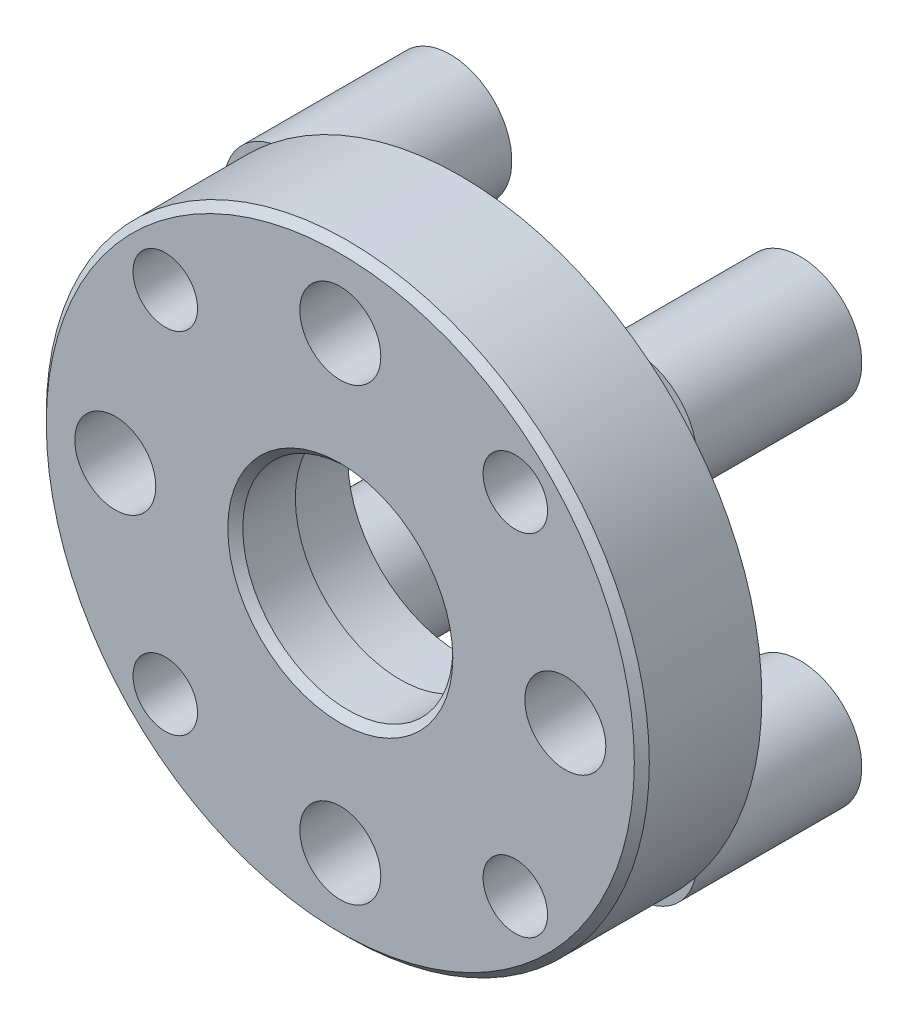
ISO-10303-21;
HEADER;
FILE_DESCRIPTION(('STEP AP214'),'2;1');
FILE_NAME('part.step','',(''),(''),'','','');
FILE_SCHEMA(('AUTOMOTIVE_DESIGN { 1 0 10303 214 1 1 1 1 }'));
ENDSEC;
DATA;
#1=APPLICATION_CONTEXT('core data for automotive mechanical design processes');
#2=APPLICATION_PROTOCOL_DEFINITION('international standard','automotive_design',2000,#1);
#3=PRODUCT_CONTEXT('',#1,'mechanical');
#4=PRODUCT('Part','Part','',(#3));
#5=PRODUCT_RELATED_PRODUCT_CATEGORY('part','',(#4));
#6=PRODUCT_DEFINITION_FORMATION('','',#4);
#7=PRODUCT_DEFINITION_CONTEXT('part definition',#1,'design');
#8=PRODUCT_DEFINITION('design','',#6,#7);
#9=PRODUCT_DEFINITION_SHAPE('','',#8);
#10=(LENGTH_UNIT() NAMED_UNIT(*) SI_UNIT(.MILLI.,.METRE.));
#11=(NAMED_UNIT(*) PLANE_ANGLE_UNIT() SI_UNIT($,.RADIAN.));
#12=(NAMED_UNIT(*) SI_UNIT($,.STERADIAN.) SOLID_ANGLE_UNIT());
#13=UNCERTAINTY_MEASURE_WITH_UNIT(LENGTH_MEASURE(1.E-05),#10,'distance_accuracy_value','');
#14=(GEOMETRIC_REPRESENTATION_CONTEXT(3) GLOBAL_UNCERTAINTY_ASSIGNED_CONTEXT((#13)) GLOBAL_UNIT_ASSIGNED_CONTEXT((#10,
#11,#12)) REPRESENTATION_CONTEXT('',''));
#15=CARTESIAN_POINT('',(0.,0.,0.));
#16=DIRECTION('',(0.,0.,1.));
#17=DIRECTION('',(1.,0.,0.));
#18=AXIS2_PLACEMENT_3D('',#15,#16,#17);
#19=CARTESIAN_POINT('',(0.,0.,31.2347367900408));
#20=DIRECTION('',(0.,0.,-1.));
#21=DIRECTION('',(-1.,0.,0.));
#22=AXIS2_PLACEMENT_3D('',#19,#20,#21);
#23=CYLINDRICAL_SURFACE('',#22,7.5);
#24=CARTESIAN_POINT('',(0.,0.,23.2347367900408));
#25=DIRECTION('',(0.,0.,1.));
#26=DIRECTION('',(1.,0.,0.));
#27=AXIS2_PLACEMENT_3D('',#24,#25,#26);
#28=CIRCLE('',#27,7.5);
#29=CARTESIAN_POINT('',(7.5,0.,23.2347367900408));
#30=VERTEX_POINT('',#29);
#31=EDGE_CURVE('E130',#30,#30,#28,.T.);
#32=ORIENTED_EDGE('',*,*,#31,.F.);
#33=EDGE_LOOP('',(#32));
#34=FACE_BOUND('',#33,.T.);
#35=CARTESIAN_POINT('',(0.,0.,27.2347367900408));
#36=DIRECTION('',(0.,0.,1.));
#37=DIRECTION('',(1.,0.,0.));
#38=AXIS2_PLACEMENT_3D('',#35,#36,#37);
#39=CIRCLE('',#38,7.5);
#40=CARTESIAN_POINT('',(7.5,0.,27.2347367900408));
#41=VERTEX_POINT('',#40);
#42=EDGE_CURVE('E342',#41,#41,#39,.T.);
#43=ORIENTED_EDGE('',*,*,#42,.T.);
#44=EDGE_LOOP('',(#43));
#45=FACE_BOUND('',#44,.T.);
#46=ADVANCED_FACE('F56',(#34,#45),#23,.F.);
#47=CARTESIAN_POINT('',(11.667261889578,-11.667261889578,12.2347367900408));
#48=DIRECTION('',(0.,0.,1.));
#49=DIRECTION('',(1.,0.,0.));
#50=AXIS2_PLACEMENT_3D('',#47,#48,#49);
#51=CYLINDRICAL_SURFACE('',#50,1.6);
#52=CARTESIAN_POINT('',(11.667261889578,-11.667261889578,15.2347367900408));
#53=DIRECTION('',(0.,0.,-1.));
#54=DIRECTION('',(-1.,0.,0.));
#55=AXIS2_PLACEMENT_3D('',#52,#53,#54);
#56=CIRCLE('',#55,1.6);
#57=CARTESIAN_POINT('',(10.067261889578,-11.667261889578,15.2347367900408));
#58=VERTEX_POINT('',#57);
#59=EDGE_CURVE('E133',#58,#58,#56,.F.);
#60=ORIENTED_EDGE('',*,*,#59,.F.);
#61=EDGE_LOOP('',(#60));
#62=FACE_BOUND('',#61,.T.);
#63=CARTESIAN_POINT('',(11.667261889578,-11.667261889578,23.2347367900408));
#64=DIRECTION('',(0.,0.,1.));
#65=DIRECTION('',(1.,0.,0.));
#66=AXIS2_PLACEMENT_3D('',#63,#64,#65);
#67=CIRCLE('',#66,1.6);
#68=CARTESIAN_POINT('',(13.267261889578,-11.667261889578,23.2347367900408));
#69=VERTEX_POINT('',#68);
#70=EDGE_CURVE('E115',#69,#69,#67,.F.);
#71=ORIENTED_EDGE('',*,*,#70,.F.);
#72=EDGE_LOOP('',(#71));
#73=FACE_BOUND('',#72,.T.);
#74=ADVANCED_FACE('F223',(#62,#73),#51,.F.);
#75=CARTESIAN_POINT('',(-11.667261889578,-11.667261889578,12.2347367900408));
#76=DIRECTION('',(0.,0.,1.));
#77=DIRECTION('',(1.,0.,0.));
#78=AXIS2_PLACEMENT_3D('',#75,#76,#77);
#79=CYLINDRICAL_SURFACE('',#78,1.6);
#80=CARTESIAN_POINT('',(-11.667261889578,-11.667261889578,15.2347367900408));
#81=DIRECTION('',(0.,0.,-1.));
#82=DIRECTION('',(-1.,0.,0.));
#83=AXIS2_PLACEMENT_3D('',#80,#81,#82);
#84=CIRCLE('',#83,1.6);
#85=CARTESIAN_POINT('',(-13.267261889578,-11.667261889578,15.2347367900408));
#86=VERTEX_POINT('',#85);
#87=EDGE_CURVE('E477',#86,#86,#84,.F.);
#88=ORIENTED_EDGE('',*,*,#87,.F.);
#89=EDGE_LOOP('',(#88));
#90=FACE_BOUND('',#89,.T.);
#91=CARTESIAN_POINT('',(-11.667261889578,-11.667261889578,23.2347367900408));
#92=DIRECTION('',(0.,0.,1.));
#93=DIRECTION('',(1.,0.,0.));
#94=AXIS2_PLACEMENT_3D('',#91,#92,#93);
#95=CIRCLE('',#94,1.6);
#96=CARTESIAN_POINT('',(-10.067261889578,-11.667261889578,23.2347367900408));
#97=VERTEX_POINT('',#96);
#98=EDGE_CURVE('E464',#97,#97,#95,.F.);
#99=ORIENTED_EDGE('',*,*,#98,.F.);
#100=EDGE_LOOP('',(#99));
#101=FACE_BOUND('',#100,.T.);
#102=ADVANCED_FACE('F231',(#90,#101),#79,.F.);
#103=CARTESIAN_POINT('',(-11.667261889578,11.667261889578,12.2347367900408));
#104=DIRECTION('',(0.,0.,1.));
#105=DIRECTION('',(1.,0.,0.));
#106=AXIS2_PLACEMENT_3D('',#103,#104,#105);
#107=CYLINDRICAL_SURFACE('',#106,1.6);
#108=CARTESIAN_POINT('',(-11.667261889578,11.667261889578,15.2347367900408));
#109=DIRECTION('',(0.,0.,-1.));
#110=DIRECTION('',(-1.,0.,0.));
#111=AXIS2_PLACEMENT_3D('',#108,#109,#110);
#112=CIRCLE('',#111,1.6);
#113=CARTESIAN_POINT('',(-13.267261889578,11.667261889578,15.2347367900408));
#114=VERTEX_POINT('',#113);
#115=EDGE_CURVE('E480',#114,#114,#112,.F.);
#116=ORIENTED_EDGE('',*,*,#115,.F.);
#117=EDGE_LOOP('',(#116));
#118=FACE_BOUND('',#117,.T.);
#119=CARTESIAN_POINT('',(-11.667261889578,11.667261889578,23.2347367900408));
#120=DIRECTION('',(0.,0.,1.));
#121=DIRECTION('',(1.,0.,0.));
#122=AXIS2_PLACEMENT_3D('',#119,#120,#121);
#123=CIRCLE('',#122,1.6);
#124=CARTESIAN_POINT('',(-10.067261889578,11.667261889578,23.2347367900408));
#125=VERTEX_POINT('',#124);
#126=EDGE_CURVE('E461',#125,#125,#123,.F.);
#127=ORIENTED_EDGE('',*,*,#126,.F.);
#128=EDGE_LOOP('',(#127));
#129=FACE_BOUND('',#128,.T.);
#130=ADVANCED_FACE('F447',(#118,#129),#107,.F.);
#131=CARTESIAN_POINT('',(11.667261889578,11.667261889578,12.2347367900408));
#132=DIRECTION('',(0.,0.,1.));
#133=DIRECTION('',(1.,0.,0.));
#134=AXIS2_PLACEMENT_3D('',#131,#132,#133);
#135=CYLINDRICAL_SURFACE('',#134,1.6);
#136=CARTESIAN_POINT('',(11.667261889578,11.667261889578,15.2347367900408));
#137=DIRECTION('',(0.,0.,-1.));
#138=DIRECTION('',(-1.,0.,0.));
#139=AXIS2_PLACEMENT_3D('',#136,#137,#138);
#140=CIRCLE('',#139,1.6);
#141=CARTESIAN_POINT('',(10.067261889578,11.667261889578,15.2347367900408));
#142=VERTEX_POINT('',#141);
#143=EDGE_CURVE('E181',#142,#142,#140,.F.);
#144=ORIENTED_EDGE('',*,*,#143,.F.);
#145=EDGE_LOOP('',(#144));
#146=FACE_BOUND('',#145,.T.);
#147=CARTESIAN_POINT('',(11.667261889578,11.667261889578,23.2347367900408));
#148=DIRECTION('',(0.,0.,1.));
#149=DIRECTION('',(1.,0.,0.));
#150=AXIS2_PLACEMENT_3D('',#147,#148,#149);
#151=CIRCLE('',#150,1.6);
#152=CARTESIAN_POINT('',(13.267261889578,11.667261889578,23.2347367900408));
#153=VERTEX_POINT('',#152);
#154=EDGE_CURVE('E313',#153,#153,#151,.F.);
#155=ORIENTED_EDGE('',*,*,#154,.F.);
#156=EDGE_LOOP('',(#155));
#157=FACE_BOUND('',#156,.T.);
#158=ADVANCED_FACE('F190',(#146,#157),#135,.F.);
#159=CARTESIAN_POINT('',(11.667261889578,11.667261889578,12.2347367900408));
#160=DIRECTION('',(0.,0.,-1.));
#161=DIRECTION('',(-1.,0.,0.));
#162=AXIS2_PLACEMENT_3D('',#159,#160,#161);
#163=PLANE('',#162);
#164=CARTESIAN_POINT('',(11.667261889578,11.667261889578,12.2347367900408));
#165=DIRECTION('',(0.,0.,-1.));
#166=DIRECTION('',(-1.,0.,0.));
#167=AXIS2_PLACEMENT_3D('',#164,#165,#166);
#168=CIRCLE('',#167,3.);
#169=CARTESIAN_POINT('',(8.66726188957803,11.667261889578,12.2347367900408));
#170=VERTEX_POINT('',#169);
#171=EDGE_CURVE('E163',#170,#170,#168,.T.);
#172=ORIENTED_EDGE('',*,*,#171,.F.);
#173=EDGE_LOOP('',(#172));
#174=FACE_BOUND('',#173,.T.);
#175=CARTESIAN_POINT('',(11.667261889578,11.667261889578,12.2347367900408));
#176=DIRECTION('',(0.,0.,-1.));
#177=DIRECTION('',(-1.,0.,0.));
#178=AXIS2_PLACEMENT_3D('',#175,#176,#177);
#179=CIRCLE('',#178,4.1);
#180=CARTESIAN_POINT('',(7.56726188957803,11.667261889578,12.2347367900408));
#181=VERTEX_POINT('',#180);
#182=EDGE_CURVE('E118',#181,#181,#179,.T.);
#183=ORIENTED_EDGE('',*,*,#182,.T.);
#184=EDGE_LOOP('',(#183));
#185=FACE_BOUND('',#184,.T.);
#186=ADVANCED_FACE('F187',(#174,#185),#163,.T.);
#187=CARTESIAN_POINT('',(11.667261889578,11.667261889578,23.2347367900408));
#188=DIRECTION('',(0.,0.,-1.));
#189=DIRECTION('',(-1.,0.,0.));
#190=AXIS2_PLACEMENT_3D('',#187,#188,#189);
#191=PLANE('',#190);
#192=CARTESIAN_POINT('',(0.,0.,23.2347367900408));
#193=DIRECTION('',(0.,0.,1.));
#194=DIRECTION('',(1.,0.,0.));
#195=AXIS2_PLACEMENT_3D('',#192,#193,#194);
#196=CIRCLE('',#195,20.1);
#197=CARTESIAN_POINT('',(15.6594660866061,12.6012349348163,23.2347367900408));
#198=VERTEX_POINT('',#197);
#199=CARTESIAN_POINT('',(12.6012349348163,15.6594660866061,23.2347367900408));
#200=VERTEX_POINT('',#199);
#201=EDGE_CURVE('E95',#198,#200,#196,.T.);
#202=ORIENTED_EDGE('',*,*,#201,.F.);
#203=CARTESIAN_POINT('',(11.667261889578,11.667261889578,23.2347367900408));
#204=DIRECTION('',(0.,0.,-1.));
#205=DIRECTION('',(-1.,0.,0.));
#206=AXIS2_PLACEMENT_3D('',#203,#204,#205);
#207=CIRCLE('',#206,4.1);
#208=EDGE_CURVE('E113',#200,#198,#207,.T.);
#209=ORIENTED_EDGE('',*,*,#208,.F.);
#210=EDGE_LOOP('',(#202,#209));
#211=FACE_BOUND('',#210,.T.);
#212=ADVANCED_FACE('F117',(#211),#191,.F.);
#213=CARTESIAN_POINT('',(0.,0.,31.2347367900408));
#214=DIRECTION('',(0.,0.,1.));
#215=DIRECTION('',(1.,0.,0.));
#216=AXIS2_PLACEMENT_3D('',#213,#214,#215);
#217=PLANE('',#216);
#218=CARTESIAN_POINT('',(0.,0.,31.2347367900408));
#219=DIRECTION('',(0.,0.,1.));
#220=DIRECTION('',(1.,0.,0.));
#221=AXIS2_PLACEMENT_3D('',#218,#219,#220);
#222=CIRCLE('',#221,7.50000000000001);
#223=CARTESIAN_POINT('',(7.50000000000001,0.,31.2347367900408));
#224=VERTEX_POINT('',#223);
#225=EDGE_CURVE('E65',#224,#224,#222,.F.);
#226=ORIENTED_EDGE('',*,*,#225,.T.);
#227=EDGE_LOOP('',(#226));
#228=FACE_BOUND('',#227,.T.);
#229=CARTESIAN_POINT('',(0.,0.,31.2347367900408));
#230=DIRECTION('',(0.,0.,1.));
#231=DIRECTION('',(1.,0.,0.));
#232=AXIS2_PLACEMENT_3D('',#229,#230,#231);
#233=CIRCLE('',#232,19.6);
#234=CARTESIAN_POINT('',(19.6,0.,31.2347367900408));
#235=VERTEX_POINT('',#234);
#236=EDGE_CURVE('E271',#235,#235,#233,.T.);
#237=ORIENTED_EDGE('',*,*,#236,.T.);
#238=EDGE_LOOP('',(#237));
#239=FACE_BOUND('',#238,.T.);
#240=CARTESIAN_POINT('',(15.,0.,31.2347367900408));
#241=DIRECTION('',(0.,0.,1.));
#242=DIRECTION('',(1.,0.,0.));
#243=AXIS2_PLACEMENT_3D('',#240,#241,#242);
#244=CIRCLE('',#243,2.7);
#245=CARTESIAN_POINT('',(17.7,0.,31.2347367900408));
#246=VERTEX_POINT('',#245);
#247=EDGE_CURVE('E283',#246,#246,#244,.T.);
#248=ORIENTED_EDGE('',*,*,#247,.F.);
#249=EDGE_LOOP('',(#248));
#250=FACE_BOUND('',#249,.T.);
#251=CARTESIAN_POINT('',(-1.04744440165294E-13,-15.,31.2347367900408));
#252=DIRECTION('',(0.,0.,1.));
#253=DIRECTION('',(1.,0.,0.));
#254=AXIS2_PLACEMENT_3D('',#251,#252,#253);
#255=CIRCLE('',#254,2.7);
#256=CARTESIAN_POINT('',(2.6999999999999,-15.,31.2347367900408));
#257=VERTEX_POINT('',#256);
#258=EDGE_CURVE('E287',#257,#257,#255,.T.);
#259=ORIENTED_EDGE('',*,*,#258,.F.);
#260=EDGE_LOOP('',(#259));
#261=FACE_BOUND('',#260,.T.);
#262=CARTESIAN_POINT('',(-15.,1.57116660247941E-13,31.2347367900408));
#263=DIRECTION('',(0.,0.,1.));
#264=DIRECTION('',(1.,0.,0.));
#265=AXIS2_PLACEMENT_3D('',#262,#263,#264);
#266=CIRCLE('',#265,2.7);
#267=CARTESIAN_POINT('',(-12.3,1.57116660247941E-13,31.2347367900408));
#268=VERTEX_POINT('',#267);
#269=EDGE_CURVE('E291',#268,#268,#266,.T.);
#270=ORIENTED_EDGE('',*,*,#269,.F.);
#271=EDGE_LOOP('',(#270));
#272=FACE_BOUND('',#271,.T.);
#273=CARTESIAN_POINT('',(-11.667261889578,11.667261889578,31.2347367900408));
#274=DIRECTION('',(0.,0.,1.));
#275=DIRECTION('',(1.,0.,0.));
#276=AXIS2_PLACEMENT_3D('',#273,#274,#275);
#277=CIRCLE('',#276,2.15);
#278=CARTESIAN_POINT('',(-9.51726188957804,11.667261889578,31.2347367900408));
#279=VERTEX_POINT('',#278);
#280=EDGE_CURVE('E295',#279,#279,#277,.T.);
#281=ORIENTED_EDGE('',*,*,#280,.F.);
#282=EDGE_LOOP('',(#281));
#283=FACE_BOUND('',#282,.T.);
#284=CARTESIAN_POINT('',(11.667261889578,11.667261889578,31.2347367900408));
#285=DIRECTION('',(0.,0.,1.));
#286=DIRECTION('',(1.,0.,0.));
#287=AXIS2_PLACEMENT_3D('',#284,#285,#286);
#288=CIRCLE('',#287,2.15);
#289=CARTESIAN_POINT('',(13.817261889578,11.667261889578,31.2347367900408));
#290=VERTEX_POINT('',#289);
#291=EDGE_CURVE('E299',#290,#290,#288,.T.);
#292=ORIENTED_EDGE('',*,*,#291,.F.);
#293=EDGE_LOOP('',(#292));
#294=FACE_BOUND('',#293,.T.);
#295=CARTESIAN_POINT('',(11.667261889578,-11.667261889578,31.2347367900408));
#296=DIRECTION('',(0.,0.,1.));
#297=DIRECTION('',(1.,0.,0.));
#298=AXIS2_PLACEMENT_3D('',#295,#296,#297);
#299=CIRCLE('',#298,2.15);
#300=CARTESIAN_POINT('',(13.817261889578,-11.667261889578,31.2347367900408));
#301=VERTEX_POINT('',#300);
#302=EDGE_CURVE('E303',#301,#301,#299,.T.);
#303=ORIENTED_EDGE('',*,*,#302,.F.);
#304=EDGE_LOOP('',(#303));
#305=FACE_BOUND('',#304,.T.);
#306=CARTESIAN_POINT('',(-11.667261889578,-11.667261889578,31.2347367900408));
#307=DIRECTION('',(0.,0.,1.));
#308=DIRECTION('',(1.,0.,0.));
#309=AXIS2_PLACEMENT_3D('',#306,#307,#308);
#310=CIRCLE('',#309,2.15);
#311=CARTESIAN_POINT('',(-9.51726188957803,-11.667261889578,31.2347367900408));
#312=VERTEX_POINT('',#311);
#313=EDGE_CURVE('E307',#312,#312,#310,.T.);
#314=ORIENTED_EDGE('',*,*,#313,.F.);
#315=EDGE_LOOP('',(#314));
#316=FACE_BOUND('',#315,.T.);
#317=CARTESIAN_POINT('',(0.,15.,31.2347367900408));
#318=DIRECTION('',(0.,0.,1.));
#319=DIRECTION('',(1.,0.,0.));
#320=AXIS2_PLACEMENT_3D('',#317,#318,#319);
#321=CIRCLE('',#320,2.7);
#322=CARTESIAN_POINT('',(2.7,15.,31.2347367900408));
#323=VERTEX_POINT('',#322);
#324=EDGE_CURVE('E199',#323,#323,#321,.T.);
#325=ORIENTED_EDGE('',*,*,#324,.F.);
#326=EDGE_LOOP('',(#325));
#327=FACE_BOUND('',#326,.T.);
#328=ADVANCED_FACE('F240',(#228,#239,#250,#261,#272,#283,#294,#305,#316,#327),#217,.T.);
#329=CARTESIAN_POINT('',(0.,0.,23.2347367900408));
#330=DIRECTION('',(0.,0.,1.));
#331=DIRECTION('',(1.,0.,0.));
#332=AXIS2_PLACEMENT_3D('',#329,#330,#331);
#333=PLANE('',#332);
#334=CARTESIAN_POINT('',(15.,0.,23.2347367900408));
#335=DIRECTION('',(0.,0.,1.));
#336=DIRECTION('',(1.,0.,0.));
#337=AXIS2_PLACEMENT_3D('',#334,#335,#336);
#338=CIRCLE('',#337,2.7);
#339=CARTESIAN_POINT('',(17.7,0.,23.2347367900408));
#340=VERTEX_POINT('',#339);
#341=EDGE_CURVE('E314',#340,#340,#338,.T.);
#342=ORIENTED_EDGE('',*,*,#341,.T.);
#343=EDGE_LOOP('',(#342));
#344=FACE_BOUND('',#343,.T.);
#345=CARTESIAN_POINT('',(-1.04744440165294E-13,-15.,23.2347367900408));
#346=DIRECTION('',(0.,0.,1.));
#347=DIRECTION('',(1.,0.,0.));
#348=AXIS2_PLACEMENT_3D('',#345,#346,#347);
#349=CIRCLE('',#348,2.7);
#350=CARTESIAN_POINT('',(2.6999999999999,-15.,23.2347367900408));
#351=VERTEX_POINT('',#350);
#352=EDGE_CURVE('E324',#351,#351,#349,.T.);
#353=ORIENTED_EDGE('',*,*,#352,.T.);
#354=EDGE_LOOP('',(#353));
#355=FACE_BOUND('',#354,.T.);
#356=CARTESIAN_POINT('',(-15.,1.57116660247941E-13,23.2347367900408));
#357=DIRECTION('',(0.,0.,1.));
#358=DIRECTION('',(1.,0.,0.));
#359=AXIS2_PLACEMENT_3D('',#356,#357,#358);
#360=CIRCLE('',#359,2.7);
#361=CARTESIAN_POINT('',(-12.3,1.57116660247941E-13,23.2347367900408));
#362=VERTEX_POINT('',#361);
#363=EDGE_CURVE('E328',#362,#362,#360,.T.);
#364=ORIENTED_EDGE('',*,*,#363,.T.);
#365=EDGE_LOOP('',(#364));
#366=FACE_BOUND('',#365,.T.);
#367=CARTESIAN_POINT('',(0.,15.,23.2347367900408));
#368=DIRECTION('',(0.,0.,1.));
#369=DIRECTION('',(1.,0.,0.));
#370=AXIS2_PLACEMENT_3D('',#367,#368,#369);
#371=CIRCLE('',#370,2.7);
#372=CARTESIAN_POINT('',(2.7,15.,23.2347367900408));
#373=VERTEX_POINT('',#372);
#374=EDGE_CURVE('E311',#373,#373,#371,.T.);
#375=ORIENTED_EDGE('',*,*,#374,.T.);
#376=EDGE_LOOP('',(#375));
#377=FACE_BOUND('',#376,.T.);
#378=CARTESIAN_POINT('',(-12.6012349348163,15.6594660866061,23.2347367900408));
#379=VERTEX_POINT('',#378);
#380=EDGE_CURVE('E99',#200,#379,#196,.T.);
#381=ORIENTED_EDGE('',*,*,#380,.F.);
#382=EDGE_CURVE('E110',#198,#200,#207,.T.);
#383=ORIENTED_EDGE('',*,*,#382,.F.);
#384=CARTESIAN_POINT('',(15.6594660866061,-12.6012349348163,23.2347367900408));
#385=VERTEX_POINT('',#384);
#386=EDGE_CURVE('E101',#385,#198,#196,.T.);
#387=ORIENTED_EDGE('',*,*,#386,.F.);
#388=CARTESIAN_POINT('',(11.667261889578,-11.667261889578,23.2347367900408));
#389=DIRECTION('',(0.,0.,-1.));
#390=DIRECTION('',(-1.,0.,0.));
#391=AXIS2_PLACEMENT_3D('',#388,#389,#390);
#392=CIRCLE('',#391,4.1);
#393=CARTESIAN_POINT('',(12.6012349348163,-15.6594660866061,23.2347367900408));
#394=VERTEX_POINT('',#393);
#395=EDGE_CURVE('E194',#394,#385,#392,.T.);
#396=ORIENTED_EDGE('',*,*,#395,.F.);
#397=CARTESIAN_POINT('',(-12.6012349348162,-15.6594660866061,23.2347367900408));
#398=VERTEX_POINT('',#397);
#399=EDGE_CURVE('E131',#398,#394,#196,.T.);
#400=ORIENTED_EDGE('',*,*,#399,.F.);
#401=CARTESIAN_POINT('',(-11.667261889578,-11.667261889578,23.2347367900408));
#402=DIRECTION('',(0.,0.,-1.));
#403=DIRECTION('',(-1.,0.,0.));
#404=AXIS2_PLACEMENT_3D('',#401,#402,#403);
#405=CIRCLE('',#404,4.1);
#406=CARTESIAN_POINT('',(-15.6594660866061,-12.6012349348163,23.2347367900408));
#407=VERTEX_POINT('',#406);
#408=EDGE_CURVE('E145',#407,#398,#405,.T.);
#409=ORIENTED_EDGE('',*,*,#408,.F.);
#410=CARTESIAN_POINT('',(-15.6594660866061,12.6012349348162,23.2347367900408));
#411=VERTEX_POINT('',#410);
#412=EDGE_CURVE('E126',#411,#407,#196,.T.);
#413=ORIENTED_EDGE('',*,*,#412,.F.);
#414=CARTESIAN_POINT('',(-11.667261889578,11.667261889578,23.2347367900408));
#415=DIRECTION('',(0.,0.,-1.));
#416=DIRECTION('',(-1.,0.,0.));
#417=AXIS2_PLACEMENT_3D('',#414,#415,#416);
#418=CIRCLE('',#417,4.1);
#419=EDGE_CURVE('E124',#379,#411,#418,.T.);
#420=ORIENTED_EDGE('',*,*,#419,.F.);
#421=EDGE_LOOP('',(#381,#383,#387,#396,#400,#409,#413,#420));
#422=FACE_BOUND('',#421,.T.);
#423=ORIENTED_EDGE('',*,*,#31,.T.);
#424=EDGE_LOOP('',(#423));
#425=FACE_BOUND('',#424,.T.);
#426=ADVANCED_FACE('F120',(#344,#355,#366,#377,#422,#425),#333,.F.);
#427=CARTESIAN_POINT('',(0.,0.,31.2347367900408));
#428=DIRECTION('',(0.,0.,-1.));
#429=DIRECTION('',(-1.,0.,0.));
#430=AXIS2_PLACEMENT_3D('',#427,#428,#429);
#431=CYLINDRICAL_SURFACE('',#430,20.1);
#432=CARTESIAN_POINT('',(0.,0.,30.7347367900408));
#433=DIRECTION('',(0.,0.,1.));
#434=DIRECTION('',(1.,0.,0.));
#435=AXIS2_PLACEMENT_3D('',#432,#433,#434);
#436=CIRCLE('',#435,20.1);
#437=CARTESIAN_POINT('',(20.1,0.,30.7347367900408));
#438=VERTEX_POINT('',#437);
#439=EDGE_CURVE('E12',#438,#438,#436,.F.);
#440=ORIENTED_EDGE('',*,*,#439,.T.);
#441=EDGE_LOOP('',(#440));
#442=FACE_BOUND('',#441,.T.);
#443=ORIENTED_EDGE('',*,*,#201,.T.);
#444=ORIENTED_EDGE('',*,*,#380,.T.);
#445=EDGE_CURVE('E107',#379,#411,#196,.T.);
#446=ORIENTED_EDGE('',*,*,#445,.T.);
#447=ORIENTED_EDGE('',*,*,#412,.T.);
#448=EDGE_CURVE('E127',#407,#398,#196,.T.);
#449=ORIENTED_EDGE('',*,*,#448,.T.);
#450=ORIENTED_EDGE('',*,*,#399,.T.);
#451=EDGE_CURVE('E72',#394,#385,#196,.T.);
#452=ORIENTED_EDGE('',*,*,#451,.T.);
#453=ORIENTED_EDGE('',*,*,#386,.T.);
#454=EDGE_LOOP('',(#443,#444,#446,#447,#449,#450,#452,#453));
#455=FACE_BOUND('',#454,.T.);
#456=ADVANCED_FACE('F97',(#442,#455),#431,.T.);
#457=CARTESIAN_POINT('',(-11.667261889578,11.667261889578,12.2347367900408));
#458=DIRECTION('',(0.,0.,-1.));
#459=DIRECTION('',(-1.,0.,0.));
#460=AXIS2_PLACEMENT_3D('',#457,#458,#459);
#461=PLANE('',#460);
#462=CARTESIAN_POINT('',(-11.667261889578,11.667261889578,12.2347367900408));
#463=DIRECTION('',(0.,0.,-1.));
#464=DIRECTION('',(-1.,0.,0.));
#465=AXIS2_PLACEMENT_3D('',#462,#463,#464);
#466=CIRCLE('',#465,3.);
#467=CARTESIAN_POINT('',(-14.667261889578,11.667261889578,12.2347367900408));
#468=VERTEX_POINT('',#467);
#469=EDGE_CURVE('E173',#468,#468,#466,.T.);
#470=ORIENTED_EDGE('',*,*,#469,.F.);
#471=EDGE_LOOP('',(#470));
#472=FACE_BOUND('',#471,.T.);
#473=CARTESIAN_POINT('',(-11.667261889578,11.667261889578,12.2347367900408));
#474=DIRECTION('',(0.,0.,-1.));
#475=DIRECTION('',(-1.,0.,0.));
#476=AXIS2_PLACEMENT_3D('',#473,#474,#475);
#477=CIRCLE('',#476,4.1);
#478=CARTESIAN_POINT('',(-15.767261889578,11.667261889578,12.2347367900408));
#479=VERTEX_POINT('',#478);
#480=EDGE_CURVE('E150',#479,#479,#477,.T.);
#481=ORIENTED_EDGE('',*,*,#480,.T.);
#482=EDGE_LOOP('',(#481));
#483=FACE_BOUND('',#482,.T.);
#484=ADVANCED_FACE('F238',(#472,#483),#461,.T.);
#485=CARTESIAN_POINT('',(-11.667261889578,11.667261889578,23.2347367900408));
#486=DIRECTION('',(0.,0.,-1.));
#487=DIRECTION('',(-1.,0.,0.));
#488=AXIS2_PLACEMENT_3D('',#485,#486,#487);
#489=PLANE('',#488);
#490=ORIENTED_EDGE('',*,*,#445,.F.);
#491=EDGE_CURVE('E155',#411,#379,#418,.T.);
#492=ORIENTED_EDGE('',*,*,#491,.F.);
#493=EDGE_LOOP('',(#490,#492));
#494=FACE_BOUND('',#493,.T.);
#495=ADVANCED_FACE('F680',(#494),#489,.F.);
#496=CARTESIAN_POINT('',(-11.667261889578,-11.667261889578,12.2347367900408));
#497=DIRECTION('',(0.,0.,-1.));
#498=DIRECTION('',(-1.,0.,0.));
#499=AXIS2_PLACEMENT_3D('',#496,#497,#498);
#500=PLANE('',#499);
#501=CARTESIAN_POINT('',(-11.667261889578,-11.667261889578,12.2347367900408));
#502=DIRECTION('',(0.,0.,-1.));
#503=DIRECTION('',(-1.,0.,0.));
#504=AXIS2_PLACEMENT_3D('',#501,#502,#503);
#505=CIRCLE('',#504,3.);
#506=CARTESIAN_POINT('',(-14.667261889578,-11.667261889578,12.2347367900408));
#507=VERTEX_POINT('',#506);
#508=EDGE_CURVE('E167',#507,#507,#505,.T.);
#509=ORIENTED_EDGE('',*,*,#508,.F.);
#510=EDGE_LOOP('',(#509));
#511=FACE_BOUND('',#510,.T.);
#512=CARTESIAN_POINT('',(-11.667261889578,-11.667261889578,12.2347367900408));
#513=DIRECTION('',(0.,0.,-1.));
#514=DIRECTION('',(-1.,0.,0.));
#515=AXIS2_PLACEMENT_3D('',#512,#513,#514);
#516=CIRCLE('',#515,4.1);
#517=CARTESIAN_POINT('',(-15.767261889578,-11.667261889578,12.2347367900408));
#518=VERTEX_POINT('',#517);
#519=EDGE_CURVE('E147',#518,#518,#516,.T.);
#520=ORIENTED_EDGE('',*,*,#519,.T.);
#521=EDGE_LOOP('',(#520));
#522=FACE_BOUND('',#521,.T.);
#523=ADVANCED_FACE('F689',(#511,#522),#500,.T.);
#524=CARTESIAN_POINT('',(-11.667261889578,-11.667261889578,23.2347367900408));
#525=DIRECTION('',(0.,0.,-1.));
#526=DIRECTION('',(-1.,0.,0.));
#527=AXIS2_PLACEMENT_3D('',#524,#525,#526);
#528=PLANE('',#527);
#529=ORIENTED_EDGE('',*,*,#448,.F.);
#530=EDGE_CURVE('E142',#398,#407,#405,.T.);
#531=ORIENTED_EDGE('',*,*,#530,.F.);
#532=EDGE_LOOP('',(#529,#531));
#533=FACE_BOUND('',#532,.T.);
#534=ADVANCED_FACE('F218',(#533),#528,.F.);
#535=CARTESIAN_POINT('',(11.667261889578,-11.667261889578,12.2347367900408));
#536=DIRECTION('',(0.,0.,-1.));
#537=DIRECTION('',(-1.,0.,0.));
#538=AXIS2_PLACEMENT_3D('',#535,#536,#537);
#539=PLANE('',#538);
#540=CARTESIAN_POINT('',(11.667261889578,-11.667261889578,12.2347367900408));
#541=DIRECTION('',(0.,0.,-1.));
#542=DIRECTION('',(-1.,0.,0.));
#543=AXIS2_PLACEMENT_3D('',#540,#541,#542);
#544=CIRCLE('',#543,3.);
#545=CARTESIAN_POINT('',(8.66726188957804,-11.667261889578,12.2347367900408));
#546=VERTEX_POINT('',#545);
#547=EDGE_CURVE('E160',#546,#546,#544,.T.);
#548=ORIENTED_EDGE('',*,*,#547,.F.);
#549=EDGE_LOOP('',(#548));
#550=FACE_BOUND('',#549,.T.);
#551=CARTESIAN_POINT('',(11.667261889578,-11.667261889578,12.2347367900408));
#552=DIRECTION('',(0.,0.,-1.));
#553=DIRECTION('',(-1.,0.,0.));
#554=AXIS2_PLACEMENT_3D('',#551,#552,#553);
#555=CIRCLE('',#554,4.1);
#556=CARTESIAN_POINT('',(7.56726188957804,-11.667261889578,12.2347367900408));
#557=VERTEX_POINT('',#556);
#558=EDGE_CURVE('E152',#557,#557,#555,.T.);
#559=ORIENTED_EDGE('',*,*,#558,.T.);
#560=EDGE_LOOP('',(#559));
#561=FACE_BOUND('',#560,.T.);
#562=ADVANCED_FACE('F209',(#550,#561),#539,.T.);
#563=CARTESIAN_POINT('',(11.667261889578,-11.667261889578,23.2347367900408));
#564=DIRECTION('',(0.,0.,-1.));
#565=DIRECTION('',(-1.,0.,0.));
#566=AXIS2_PLACEMENT_3D('',#563,#564,#565);
#567=PLANE('',#566);
#568=ORIENTED_EDGE('',*,*,#451,.F.);
#569=EDGE_CURVE('E197',#385,#394,#392,.T.);
#570=ORIENTED_EDGE('',*,*,#569,.F.);
#571=EDGE_LOOP('',(#568,#570));
#572=FACE_BOUND('',#571,.T.);
#573=ADVANCED_FACE('F206',(#572),#567,.F.);
#574=CARTESIAN_POINT('',(11.667261889578,11.667261889578,15.2347367900408));
#575=DIRECTION('',(0.,0.,-1.));
#576=DIRECTION('',(-1.,0.,0.));
#577=AXIS2_PLACEMENT_3D('',#574,#575,#576);
#578=PLANE('',#577);
#579=CARTESIAN_POINT('',(11.667261889578,11.667261889578,15.2347367900408));
#580=DIRECTION('',(0.,0.,-1.));
#581=DIRECTION('',(-1.,0.,0.));
#582=AXIS2_PLACEMENT_3D('',#579,#580,#581);
#583=CIRCLE('',#582,3.);
#584=CARTESIAN_POINT('',(8.66726188957803,11.667261889578,15.2347367900408));
#585=VERTEX_POINT('',#584);
#586=EDGE_CURVE('E178',#585,#585,#583,.T.);
#587=ORIENTED_EDGE('',*,*,#586,.T.);
#588=EDGE_LOOP('',(#587));
#589=FACE_BOUND('',#588,.T.);
#590=ORIENTED_EDGE('',*,*,#143,.T.);
#591=EDGE_LOOP('',(#590));
#592=FACE_BOUND('',#591,.T.);
#593=ADVANCED_FACE('F208',(#589,#592),#578,.T.);
#594=CARTESIAN_POINT('',(11.667261889578,11.667261889578,15.2347367900408));
#595=DIRECTION('',(0.,0.,-1.));
#596=DIRECTION('',(-1.,0.,0.));
#597=AXIS2_PLACEMENT_3D('',#594,#595,#596);
#598=CYLINDRICAL_SURFACE('',#597,3.);
#599=ORIENTED_EDGE('',*,*,#586,.F.);
#600=EDGE_LOOP('',(#599));
#601=FACE_BOUND('',#600,.T.);
#602=ORIENTED_EDGE('',*,*,#171,.T.);
#603=EDGE_LOOP('',(#602));
#604=FACE_BOUND('',#603,.T.);
#605=ADVANCED_FACE('F185',(#601,#604),#598,.F.);
#606=CARTESIAN_POINT('',(-11.667261889578,11.667261889578,15.2347367900408));
#607=DIRECTION('',(0.,0.,-1.));
#608=DIRECTION('',(-1.,0.,0.));
#609=AXIS2_PLACEMENT_3D('',#606,#607,#608);
#610=PLANE('',#609);
#611=CARTESIAN_POINT('',(-11.667261889578,11.667261889578,15.2347367900408));
#612=DIRECTION('',(0.,0.,-1.));
#613=DIRECTION('',(-1.,0.,0.));
#614=AXIS2_PLACEMENT_3D('',#611,#612,#613);
#615=CIRCLE('',#614,3.);
#616=CARTESIAN_POINT('',(-14.667261889578,11.667261889578,15.2347367900408));
#617=VERTEX_POINT('',#616);
#618=EDGE_CURVE('E157',#617,#617,#615,.T.);
#619=ORIENTED_EDGE('',*,*,#618,.T.);
#620=EDGE_LOOP('',(#619));
#621=FACE_BOUND('',#620,.T.);
#622=ORIENTED_EDGE('',*,*,#115,.T.);
#623=EDGE_LOOP('',(#622));
#624=FACE_BOUND('',#623,.T.);
#625=ADVANCED_FACE('F437',(#621,#624),#610,.T.);
#626=CARTESIAN_POINT('',(-11.667261889578,11.667261889578,15.2347367900408));
#627=DIRECTION('',(0.,0.,-1.));
#628=DIRECTION('',(-1.,0.,0.));
#629=AXIS2_PLACEMENT_3D('',#626,#627,#628);
#630=CYLINDRICAL_SURFACE('',#629,3.);
#631=ORIENTED_EDGE('',*,*,#618,.F.);
#632=EDGE_LOOP('',(#631));
#633=FACE_BOUND('',#632,.T.);
#634=ORIENTED_EDGE('',*,*,#469,.T.);
#635=EDGE_LOOP('',(#634));
#636=FACE_BOUND('',#635,.T.);
#637=ADVANCED_FACE('F433',(#633,#636),#630,.F.);
#638=CARTESIAN_POINT('',(-11.667261889578,-11.667261889578,15.2347367900408));
#639=DIRECTION('',(0.,0.,-1.));
#640=DIRECTION('',(-1.,0.,0.));
#641=AXIS2_PLACEMENT_3D('',#638,#639,#640);
#642=PLANE('',#641);
#643=CARTESIAN_POINT('',(-11.667261889578,-11.667261889578,15.2347367900408));
#644=DIRECTION('',(0.,0.,-1.));
#645=DIRECTION('',(-1.,0.,0.));
#646=AXIS2_PLACEMENT_3D('',#643,#644,#645);
#647=CIRCLE('',#646,3.);
#648=CARTESIAN_POINT('',(-14.667261889578,-11.667261889578,15.2347367900408));
#649=VERTEX_POINT('',#648);
#650=EDGE_CURVE('E170',#649,#649,#647,.T.);
#651=ORIENTED_EDGE('',*,*,#650,.T.);
#652=EDGE_LOOP('',(#651));
#653=FACE_BOUND('',#652,.T.);
#654=ORIENTED_EDGE('',*,*,#87,.T.);
#655=EDGE_LOOP('',(#654));
#656=FACE_BOUND('',#655,.T.);
#657=ADVANCED_FACE('F429',(#653,#656),#642,.T.);
#658=CARTESIAN_POINT('',(-11.667261889578,-11.667261889578,15.2347367900408));
#659=DIRECTION('',(0.,0.,-1.));
#660=DIRECTION('',(-1.,0.,0.));
#661=AXIS2_PLACEMENT_3D('',#658,#659,#660);
#662=CYLINDRICAL_SURFACE('',#661,3.);
#663=ORIENTED_EDGE('',*,*,#650,.F.);
#664=EDGE_LOOP('',(#663));
#665=FACE_BOUND('',#664,.T.);
#666=ORIENTED_EDGE('',*,*,#508,.T.);
#667=EDGE_LOOP('',(#666));
#668=FACE_BOUND('',#667,.T.);
#669=ADVANCED_FACE('F425',(#665,#668),#662,.F.);
#670=CARTESIAN_POINT('',(11.667261889578,-11.667261889578,15.2347367900408));
#671=DIRECTION('',(0.,0.,-1.));
#672=DIRECTION('',(-1.,0.,0.));
#673=AXIS2_PLACEMENT_3D('',#670,#671,#672);
#674=PLANE('',#673);
#675=CARTESIAN_POINT('',(11.667261889578,-11.667261889578,15.2347367900408));
#676=DIRECTION('',(0.,0.,-1.));
#677=DIRECTION('',(-1.,0.,0.));
#678=AXIS2_PLACEMENT_3D('',#675,#676,#677);
#679=CIRCLE('',#678,3.);
#680=CARTESIAN_POINT('',(8.66726188957804,-11.667261889578,15.2347367900408));
#681=VERTEX_POINT('',#680);
#682=EDGE_CURVE('E164',#681,#681,#679,.T.);
#683=ORIENTED_EDGE('',*,*,#682,.T.);
#684=EDGE_LOOP('',(#683));
#685=FACE_BOUND('',#684,.T.);
#686=ORIENTED_EDGE('',*,*,#59,.T.);
#687=EDGE_LOOP('',(#686));
#688=FACE_BOUND('',#687,.T.);
#689=ADVANCED_FACE('F421',(#685,#688),#674,.T.);
#690=CARTESIAN_POINT('',(11.667261889578,-11.667261889578,15.2347367900408));
#691=DIRECTION('',(0.,0.,-1.));
#692=DIRECTION('',(-1.,0.,0.));
#693=AXIS2_PLACEMENT_3D('',#690,#691,#692);
#694=CYLINDRICAL_SURFACE('',#693,3.);
#695=ORIENTED_EDGE('',*,*,#682,.F.);
#696=EDGE_LOOP('',(#695));
#697=FACE_BOUND('',#696,.T.);
#698=ORIENTED_EDGE('',*,*,#547,.T.);
#699=EDGE_LOOP('',(#698));
#700=FACE_BOUND('',#699,.T.);
#701=ADVANCED_FACE('F417',(#697,#700),#694,.F.);
#702=CARTESIAN_POINT('',(-11.667261889578,11.667261889578,23.2347367900408));
#703=DIRECTION('',(0.,0.,-1.));
#704=DIRECTION('',(-1.,0.,0.));
#705=AXIS2_PLACEMENT_3D('',#702,#703,#704);
#706=CYLINDRICAL_SURFACE('',#705,4.1);
#707=ORIENTED_EDGE('',*,*,#491,.T.);
#708=ORIENTED_EDGE('',*,*,#419,.T.);
#709=EDGE_LOOP('',(#707,#708));
#710=FACE_BOUND('',#709,.T.);
#711=ORIENTED_EDGE('',*,*,#480,.F.);
#712=EDGE_LOOP('',(#711));
#713=FACE_BOUND('',#712,.T.);
#714=ADVANCED_FACE('F415',(#710,#713),#706,.T.);
#715=CARTESIAN_POINT('',(-11.667261889578,-11.667261889578,23.2347367900408));
#716=DIRECTION('',(0.,0.,-1.));
#717=DIRECTION('',(-1.,0.,0.));
#718=AXIS2_PLACEMENT_3D('',#715,#716,#717);
#719=CYLINDRICAL_SURFACE('',#718,4.1);
#720=ORIENTED_EDGE('',*,*,#530,.T.);
#721=ORIENTED_EDGE('',*,*,#408,.T.);
#722=EDGE_LOOP('',(#720,#721));
#723=FACE_BOUND('',#722,.T.);
#724=ORIENTED_EDGE('',*,*,#519,.F.);
#725=EDGE_LOOP('',(#724));
#726=FACE_BOUND('',#725,.T.);
#727=ADVANCED_FACE('F143',(#723,#726),#719,.T.);
#728=CARTESIAN_POINT('',(11.667261889578,-11.667261889578,23.2347367900408));
#729=DIRECTION('',(0.,0.,-1.));
#730=DIRECTION('',(-1.,0.,0.));
#731=AXIS2_PLACEMENT_3D('',#728,#729,#730);
#732=CYLINDRICAL_SURFACE('',#731,4.1);
#733=ORIENTED_EDGE('',*,*,#569,.T.);
#734=ORIENTED_EDGE('',*,*,#395,.T.);
#735=EDGE_LOOP('',(#733,#734));
#736=FACE_BOUND('',#735,.T.);
#737=ORIENTED_EDGE('',*,*,#558,.F.);
#738=EDGE_LOOP('',(#737));
#739=FACE_BOUND('',#738,.T.);
#740=ADVANCED_FACE('F204',(#736,#739),#732,.T.);
#741=CARTESIAN_POINT('',(11.667261889578,11.667261889578,23.2347367900408));
#742=DIRECTION('',(0.,0.,-1.));
#743=DIRECTION('',(-1.,0.,0.));
#744=AXIS2_PLACEMENT_3D('',#741,#742,#743);
#745=CYLINDRICAL_SURFACE('',#744,4.1);
#746=ORIENTED_EDGE('',*,*,#208,.T.);
#747=ORIENTED_EDGE('',*,*,#382,.T.);
#748=EDGE_LOOP('',(#746,#747));
#749=FACE_BOUND('',#748,.T.);
#750=ORIENTED_EDGE('',*,*,#182,.F.);
#751=EDGE_LOOP('',(#750));
#752=FACE_BOUND('',#751,.T.);
#753=ADVANCED_FACE('F111',(#749,#752),#745,.T.);
#754=CARTESIAN_POINT('',(0.,15.,23.2347367900408));
#755=DIRECTION('',(0.,0.,1.));
#756=DIRECTION('',(1.,0.,0.));
#757=AXIS2_PLACEMENT_3D('',#754,#755,#756);
#758=CYLINDRICAL_SURFACE('',#757,2.7);
#759=ORIENTED_EDGE('',*,*,#374,.F.);
#760=EDGE_LOOP('',(#759));
#761=FACE_BOUND('',#760,.T.);
#762=ORIENTED_EDGE('',*,*,#324,.T.);
#763=EDGE_LOOP('',(#762));
#764=FACE_BOUND('',#763,.T.);
#765=ADVANCED_FACE('F401',(#761,#764),#758,.F.);
#766=CARTESIAN_POINT('',(-15.,1.57116660247941E-13,23.2347367900408));
#767=DIRECTION('',(0.,0.,1.));
#768=DIRECTION('',(1.,0.,0.));
#769=AXIS2_PLACEMENT_3D('',#766,#767,#768);
#770=CYLINDRICAL_SURFACE('',#769,2.7);
#771=ORIENTED_EDGE('',*,*,#363,.F.);
#772=EDGE_LOOP('',(#771));
#773=FACE_BOUND('',#772,.T.);
#774=ORIENTED_EDGE('',*,*,#269,.T.);
#775=EDGE_LOOP('',(#774));
#776=FACE_BOUND('',#775,.T.);
#777=ADVANCED_FACE('F398',(#773,#776),#770,.F.);
#778=CARTESIAN_POINT('',(-1.04744440165294E-13,-15.,23.2347367900408));
#779=DIRECTION('',(0.,0.,1.));
#780=DIRECTION('',(1.,0.,0.));
#781=AXIS2_PLACEMENT_3D('',#778,#779,#780);
#782=CYLINDRICAL_SURFACE('',#781,2.7);
#783=ORIENTED_EDGE('',*,*,#352,.F.);
#784=EDGE_LOOP('',(#783));
#785=FACE_BOUND('',#784,.T.);
#786=ORIENTED_EDGE('',*,*,#258,.T.);
#787=EDGE_LOOP('',(#786));
#788=FACE_BOUND('',#787,.T.);
#789=ADVANCED_FACE('F394',(#785,#788),#782,.F.);
#790=CARTESIAN_POINT('',(15.,0.,23.2347367900408));
#791=DIRECTION('',(0.,0.,1.));
#792=DIRECTION('',(1.,0.,0.));
#793=AXIS2_PLACEMENT_3D('',#790,#791,#792);
#794=CYLINDRICAL_SURFACE('',#793,2.7);
#795=ORIENTED_EDGE('',*,*,#341,.F.);
#796=EDGE_LOOP('',(#795));
#797=FACE_BOUND('',#796,.T.);
#798=ORIENTED_EDGE('',*,*,#247,.T.);
#799=EDGE_LOOP('',(#798));
#800=FACE_BOUND('',#799,.T.);
#801=ADVANCED_FACE('F391',(#797,#800),#794,.F.);
#802=CARTESIAN_POINT('',(-11.667261889578,-11.667261889578,23.2347367900408));
#803=DIRECTION('',(0.,0.,1.));
#804=DIRECTION('',(1.,0.,0.));
#805=AXIS2_PLACEMENT_3D('',#802,#803,#804);
#806=PLANE('',#805);
#807=CARTESIAN_POINT('',(-11.667261889578,-11.667261889578,23.2347367900408));
#808=DIRECTION('',(0.,0.,1.));
#809=DIRECTION('',(1.,0.,0.));
#810=AXIS2_PLACEMENT_3D('',#807,#808,#809);
#811=CIRCLE('',#810,2.15);
#812=CARTESIAN_POINT('',(-9.51726188957803,-11.667261889578,23.2347367900408));
#813=VERTEX_POINT('',#812);
#814=EDGE_CURVE('E320',#813,#813,#811,.T.);
#815=ORIENTED_EDGE('',*,*,#814,.T.);
#816=EDGE_LOOP('',(#815));
#817=FACE_BOUND('',#816,.T.);
#818=ORIENTED_EDGE('',*,*,#98,.T.);
#819=EDGE_LOOP('',(#818));
#820=FACE_BOUND('',#819,.T.);
#821=ADVANCED_FACE('F387',(#817,#820),#806,.T.);
#822=CARTESIAN_POINT('',(-11.667261889578,-11.667261889578,23.2347367900408));
#823=DIRECTION('',(0.,0.,1.));
#824=DIRECTION('',(1.,0.,0.));
#825=AXIS2_PLACEMENT_3D('',#822,#823,#824);
#826=CYLINDRICAL_SURFACE('',#825,2.15);
#827=ORIENTED_EDGE('',*,*,#814,.F.);
#828=EDGE_LOOP('',(#827));
#829=FACE_BOUND('',#828,.T.);
#830=ORIENTED_EDGE('',*,*,#313,.T.);
#831=EDGE_LOOP('',(#830));
#832=FACE_BOUND('',#831,.T.);
#833=ADVANCED_FACE('F383',(#829,#832),#826,.F.);
#834=CARTESIAN_POINT('',(11.667261889578,-11.667261889578,23.2347367900408));
#835=DIRECTION('',(0.,0.,1.));
#836=DIRECTION('',(1.,0.,0.));
#837=AXIS2_PLACEMENT_3D('',#834,#835,#836);
#838=PLANE('',#837);
#839=CARTESIAN_POINT('',(11.667261889578,-11.667261889578,23.2347367900408));
#840=DIRECTION('',(0.,0.,1.));
#841=DIRECTION('',(1.,0.,0.));
#842=AXIS2_PLACEMENT_3D('',#839,#840,#841);
#843=CIRCLE('',#842,2.15);
#844=CARTESIAN_POINT('',(13.817261889578,-11.667261889578,23.2347367900408));
#845=VERTEX_POINT('',#844);
#846=EDGE_CURVE('E346',#845,#845,#843,.T.);
#847=ORIENTED_EDGE('',*,*,#846,.T.);
#848=EDGE_LOOP('',(#847));
#849=FACE_BOUND('',#848,.T.);
#850=ORIENTED_EDGE('',*,*,#70,.T.);
#851=EDGE_LOOP('',(#850));
#852=FACE_BOUND('',#851,.T.);
#853=ADVANCED_FACE('F379',(#849,#852),#838,.T.);
#854=CARTESIAN_POINT('',(11.667261889578,-11.667261889578,23.2347367900408));
#855=DIRECTION('',(0.,0.,1.));
#856=DIRECTION('',(1.,0.,0.));
#857=AXIS2_PLACEMENT_3D('',#854,#855,#856);
#858=CYLINDRICAL_SURFACE('',#857,2.15);
#859=ORIENTED_EDGE('',*,*,#846,.F.);
#860=EDGE_LOOP('',(#859));
#861=FACE_BOUND('',#860,.T.);
#862=ORIENTED_EDGE('',*,*,#302,.T.);
#863=EDGE_LOOP('',(#862));
#864=FACE_BOUND('',#863,.T.);
#865=ADVANCED_FACE('F375',(#861,#864),#858,.F.);
#866=CARTESIAN_POINT('',(11.667261889578,11.667261889578,23.2347367900408));
#867=DIRECTION('',(0.,0.,1.));
#868=DIRECTION('',(1.,0.,0.));
#869=AXIS2_PLACEMENT_3D('',#866,#867,#868);
#870=PLANE('',#869);
#871=CARTESIAN_POINT('',(11.667261889578,11.667261889578,23.2347367900408));
#872=DIRECTION('',(0.,0.,1.));
#873=DIRECTION('',(1.,0.,0.));
#874=AXIS2_PLACEMENT_3D('',#871,#872,#873);
#875=CIRCLE('',#874,2.15);
#876=CARTESIAN_POINT('',(13.817261889578,11.667261889578,23.2347367900408));
#877=VERTEX_POINT('',#876);
#878=EDGE_CURVE('E336',#877,#877,#875,.T.);
#879=ORIENTED_EDGE('',*,*,#878,.T.);
#880=EDGE_LOOP('',(#879));
#881=FACE_BOUND('',#880,.T.);
#882=ORIENTED_EDGE('',*,*,#154,.T.);
#883=EDGE_LOOP('',(#882));
#884=FACE_BOUND('',#883,.T.);
#885=ADVANCED_FACE('F371',(#881,#884),#870,.T.);
#886=CARTESIAN_POINT('',(11.667261889578,11.667261889578,23.2347367900408));
#887=DIRECTION('',(0.,0.,1.));
#888=DIRECTION('',(1.,0.,0.));
#889=AXIS2_PLACEMENT_3D('',#886,#887,#888);
#890=CYLINDRICAL_SURFACE('',#889,2.15);
#891=ORIENTED_EDGE('',*,*,#878,.F.);
#892=EDGE_LOOP('',(#891));
#893=FACE_BOUND('',#892,.T.);
#894=ORIENTED_EDGE('',*,*,#291,.T.);
#895=EDGE_LOOP('',(#894));
#896=FACE_BOUND('',#895,.T.);
#897=ADVANCED_FACE('F368',(#893,#896),#890,.F.);
#898=CARTESIAN_POINT('',(-11.667261889578,11.667261889578,23.2347367900408));
#899=DIRECTION('',(0.,0.,1.));
#900=DIRECTION('',(1.,0.,0.));
#901=AXIS2_PLACEMENT_3D('',#898,#899,#900);
#902=PLANE('',#901);
#903=CARTESIAN_POINT('',(-11.667261889578,11.667261889578,23.2347367900408));
#904=DIRECTION('',(0.,0.,1.));
#905=DIRECTION('',(1.,0.,0.));
#906=AXIS2_PLACEMENT_3D('',#903,#904,#905);
#907=CIRCLE('',#906,2.15);
#908=CARTESIAN_POINT('',(-9.51726188957804,11.667261889578,23.2347367900408));
#909=VERTEX_POINT('',#908);
#910=EDGE_CURVE('E332',#909,#909,#907,.T.);
#911=ORIENTED_EDGE('',*,*,#910,.T.);
#912=EDGE_LOOP('',(#911));
#913=FACE_BOUND('',#912,.T.);
#914=ORIENTED_EDGE('',*,*,#126,.T.);
#915=EDGE_LOOP('',(#914));
#916=FACE_BOUND('',#915,.T.);
#917=ADVANCED_FACE('F364',(#913,#916),#902,.T.);
#918=CARTESIAN_POINT('',(-11.667261889578,11.667261889578,23.2347367900408));
#919=DIRECTION('',(0.,0.,1.));
#920=DIRECTION('',(1.,0.,0.));
#921=AXIS2_PLACEMENT_3D('',#918,#919,#920);
#922=CYLINDRICAL_SURFACE('',#921,2.15);
#923=ORIENTED_EDGE('',*,*,#910,.F.);
#924=EDGE_LOOP('',(#923));
#925=FACE_BOUND('',#924,.T.);
#926=ORIENTED_EDGE('',*,*,#280,.T.);
#927=EDGE_LOOP('',(#926));
#928=FACE_BOUND('',#927,.T.);
#929=ADVANCED_FACE('F360',(#925,#928),#922,.F.);
#930=CARTESIAN_POINT('',(0.,0.,27.2347367900408));
#931=DIRECTION('',(0.,0.,1.));
#932=DIRECTION('',(1.,0.,0.));
#933=AXIS2_PLACEMENT_3D('',#930,#931,#932);
#934=PLANE('',#933);
#935=CARTESIAN_POINT('',(0.,0.,27.2347367900408));
#936=DIRECTION('',(0.,0.,1.));
#937=DIRECTION('',(1.,0.,0.));
#938=AXIS2_PLACEMENT_3D('',#935,#936,#937);
#939=CIRCLE('',#938,7.);
#940=CARTESIAN_POINT('',(7.,0.,27.2347367900408));
#941=VERTEX_POINT('',#940);
#942=EDGE_CURVE('E353',#941,#941,#939,.T.);
#943=ORIENTED_EDGE('',*,*,#942,.T.);
#944=EDGE_LOOP('',(#943));
#945=FACE_BOUND('',#944,.T.);
#946=ORIENTED_EDGE('',*,*,#42,.F.);
#947=EDGE_LOOP('',(#946));
#948=FACE_BOUND('',#947,.T.);
#949=ADVANCED_FACE('F263',(#945,#948),#934,.F.);
#950=CARTESIAN_POINT('',(0.,0.,27.2347367900408));
#951=DIRECTION('',(0.,0.,1.));
#952=DIRECTION('',(1.,0.,0.));
#953=AXIS2_PLACEMENT_3D('',#950,#951,#952);
#954=CYLINDRICAL_SURFACE('',#953,7.);
#955=CARTESIAN_POINT('',(0.,0.,30.7347367900408));
#956=DIRECTION('',(0.,0.,1.));
#957=DIRECTION('',(1.,0.,0.));
#958=AXIS2_PLACEMENT_3D('',#955,#956,#957);
#959=CIRCLE('',#958,7.);
#960=CARTESIAN_POINT('',(7.,0.,30.7347367900408));
#961=VERTEX_POINT('',#960);
#962=EDGE_CURVE('E105',#961,#961,#959,.T.);
#963=ORIENTED_EDGE('',*,*,#962,.T.);
#964=EDGE_LOOP('',(#963));
#965=FACE_BOUND('',#964,.T.);
#966=ORIENTED_EDGE('',*,*,#942,.F.);
#967=EDGE_LOOP('',(#966));
#968=FACE_BOUND('',#967,.T.);
#969=ADVANCED_FACE('F256',(#965,#968),#954,.F.);
#970=CARTESIAN_POINT('',(0.,0.,30.7347367900408));
#971=DIRECTION('',(0.,0.,1.));
#972=DIRECTION('',(1.,0.,0.));
#973=AXIS2_PLACEMENT_3D('',#970,#971,#972);
#974=CONICAL_SURFACE('',#973,7.,0.785398163397445);
#975=ORIENTED_EDGE('',*,*,#225,.F.);
#976=EDGE_LOOP('',(#975));
#977=FACE_BOUND('',#976,.T.);
#978=ORIENTED_EDGE('',*,*,#962,.F.);
#979=EDGE_LOOP('',(#978));
#980=FACE_BOUND('',#979,.T.);
#981=ADVANCED_FACE('F252',(#977,#980),#974,.F.);
#982=CARTESIAN_POINT('',(0.,0.,31.2347367900408));
#983=DIRECTION('',(0.,0.,-1.));
#984=DIRECTION('',(-1.,0.,0.));
#985=AXIS2_PLACEMENT_3D('',#982,#983,#984);
#986=CONICAL_SURFACE('',#985,19.6,0.785398163397441);
#987=ORIENTED_EDGE('',*,*,#439,.F.);
#988=EDGE_LOOP('',(#987));
#989=FACE_BOUND('',#988,.T.);
#990=ORIENTED_EDGE('',*,*,#236,.F.);
#991=EDGE_LOOP('',(#990));
#992=FACE_BOUND('',#991,.T.);
#993=ADVANCED_FACE('F59',(#989,#992),#986,.T.);
#994=CLOSED_SHELL('',(#46,#74,#102,#130,#158,#186,#212,#328,#426,#456,#484,#495,#523,#534,#562,
#573,#593,#605,#625,#637,#657,#669,#689,#701,#714,#727,#740,#753,#765,#777,#789,#801,#821,#833,
#853,#865,#885,#897,#917,#929,#949,#969,#981,#993));
#995=MANIFOLD_SOLID_BREP('B2',#994);
#996=ADVANCED_BREP_SHAPE_REPRESENTATION('',(#18,#995),#14);
#997=SHAPE_DEFINITION_REPRESENTATION(#9,#996);
ENDSEC;
END-ISO-10303-21;
